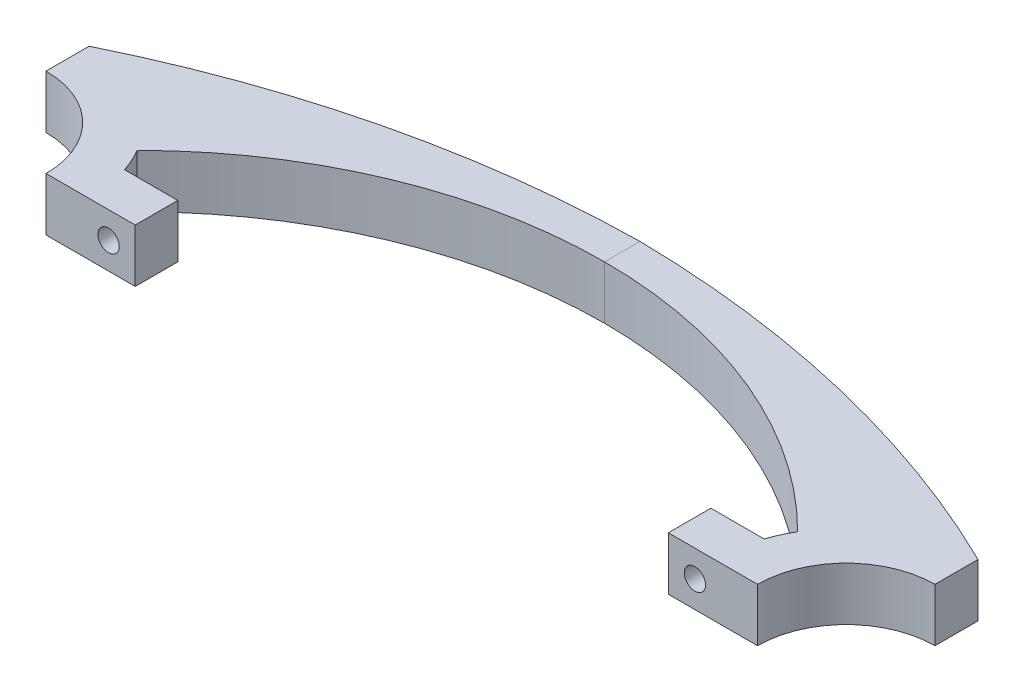
ISO-10303-21;
HEADER;
FILE_DESCRIPTION(('STEP AP214'),'2;1');
FILE_NAME('part.step','',(''),(''),'','','');
FILE_SCHEMA(('AUTOMOTIVE_DESIGN { 1 0 10303 214 1 1 1 1 }'));
ENDSEC;
DATA;
#1=APPLICATION_CONTEXT('core data for automotive mechanical design processes');
#2=APPLICATION_PROTOCOL_DEFINITION('international standard','automotive_design',2000,#1);
#3=PRODUCT_CONTEXT('',#1,'mechanical');
#4=PRODUCT('Part','Part','',(#3));
#5=PRODUCT_RELATED_PRODUCT_CATEGORY('part','',(#4));
#6=PRODUCT_DEFINITION_FORMATION('','',#4);
#7=PRODUCT_DEFINITION_CONTEXT('part definition',#1,'design');
#8=PRODUCT_DEFINITION('design','',#6,#7);
#9=PRODUCT_DEFINITION_SHAPE('','',#8);
#10=(LENGTH_UNIT() NAMED_UNIT(*) SI_UNIT(.MILLI.,.METRE.));
#11=(NAMED_UNIT(*) PLANE_ANGLE_UNIT() SI_UNIT($,.RADIAN.));
#12=(NAMED_UNIT(*) SI_UNIT($,.STERADIAN.) SOLID_ANGLE_UNIT());
#13=UNCERTAINTY_MEASURE_WITH_UNIT(LENGTH_MEASURE(1.E-05),#10,'distance_accuracy_value','');
#14=(GEOMETRIC_REPRESENTATION_CONTEXT(3) GLOBAL_UNCERTAINTY_ASSIGNED_CONTEXT((#13)) GLOBAL_UNIT_ASSIGNED_CONTEXT((#10,
#11,#12)) REPRESENTATION_CONTEXT('',''));
#15=CARTESIAN_POINT('',(0.,0.,0.));
#16=DIRECTION('',(0.,0.,1.));
#17=DIRECTION('',(1.,0.,0.));
#18=AXIS2_PLACEMENT_3D('',#15,#16,#17);
#19=CARTESIAN_POINT('',(31.2389251159793,17.8221667419848,54.0159850443195));
#20=DIRECTION('',(0.,-1.,0.));
#21=DIRECTION('',(0.,0.,1.));
#22=AXIS2_PLACEMENT_3D('',#19,#20,#21);
#23=PLANE('',#22);
#24=CARTESIAN_POINT('',(31.1865919957993,17.8221667419848,91.246780523602));
#25=DIRECTION('',(0.,-1.,0.));
#26=DIRECTION('',(0.,0.,1.));
#27=AXIS2_PLACEMENT_3D('',#24,#25,#26);
#28=CIRCLE('',#27,65.8035553224474);
#29=CARTESIAN_POINT('',(77.7660246317547,17.8221667419848,44.7659850443195));
#30=VERTEX_POINT('',#29);
#31=CARTESIAN_POINT('',(31.2389251159793,17.8221667419848,25.4432460112452));
#32=VERTEX_POINT('',#31);
#33=EDGE_CURVE('P0_E98',#30,#32,#28,.F.);
#34=ORIENTED_EDGE('',*,*,#33,.T.);
#35=DIRECTION('',(0.,0.,-1.));
#36=VECTOR('',#35,1.);
#37=CARTESIAN_POINT('',(31.2389251159793,17.8221667419848,54.0159850443195));
#38=LINE('',#37,#36);
#39=CARTESIAN_POINT('',(31.2389251159793,17.8221667419848,20.4533621410306));
#40=VERTEX_POINT('',#39);
#41=EDGE_CURVE('P0_E87',#32,#40,#38,.T.);
#42=ORIENTED_EDGE('',*,*,#41,.T.);
#43=CARTESIAN_POINT('',(29.2611846844426,17.8221667419848,166.971743858237));
#44=DIRECTION('',(0.,-1.,0.));
#45=DIRECTION('',(0.,0.,1.));
#46=AXIS2_PLACEMENT_3D('',#43,#44,#45);
#47=CIRCLE('',#46,146.53172911777);
#48=CARTESIAN_POINT('',(93.8639251159793,17.8221667419848,35.4497549477167));
#49=VERTEX_POINT('',#48);
#50=EDGE_CURVE('P0_E96',#49,#40,#47,.F.);
#51=ORIENTED_EDGE('',*,*,#50,.F.);
#52=DIRECTION('',(0.,0.,-1.));
#53=VECTOR('',#52,1.);
#54=CARTESIAN_POINT('',(93.8639251159793,17.8221667419848,54.0159850443195));
#55=LINE('',#54,#53);
#56=CARTESIAN_POINT('',(93.8639251159793,17.8221667419848,41.5159850443195));
#57=VERTEX_POINT('',#56);
#58=EDGE_CURVE('P0_E133',#57,#49,#55,.T.);
#59=ORIENTED_EDGE('',*,*,#58,.F.);
#60=CARTESIAN_POINT('',(93.8639251159793,17.8221667419848,54.0159850443195));
#61=DIRECTION('',(0.,-1.,0.));
#62=DIRECTION('',(0.,0.,1.));
#63=AXIS2_PLACEMENT_3D('',#60,#61,#62);
#64=CIRCLE('',#63,12.5);
#65=CARTESIAN_POINT('',(81.3639251159793,17.8221667419848,54.0159850443195));
#66=VERTEX_POINT('',#65);
#67=EDGE_CURVE('P0_E121',#66,#57,#64,.T.);
#68=ORIENTED_EDGE('',*,*,#67,.F.);
#69=DIRECTION('',(-1.,0.,0.));
#70=VECTOR('',#69,1.);
#71=CARTESIAN_POINT('',(31.2389251159793,17.8221667419848,54.0159850443195));
#72=LINE('',#71,#70);
#73=CARTESIAN_POINT('',(68.7939251159793,17.8221667419848,54.0159850443195));
#74=VERTEX_POINT('',#73);
#75=EDGE_CURVE('P0_E124',#66,#74,#72,.T.);
#76=ORIENTED_EDGE('',*,*,#75,.T.);
#77=DIRECTION('',(0.,0.,-1.));
#78=VECTOR('',#77,1.);
#79=CARTESIAN_POINT('',(68.7939251159793,17.8221667419848,54.0159850443195));
#80=LINE('',#79,#78);
#81=CARTESIAN_POINT('',(68.7939251159793,17.8221667419848,48.0159850443195));
#82=VERTEX_POINT('',#81);
#83=EDGE_CURVE('P0_E127',#74,#82,#80,.T.);
#84=ORIENTED_EDGE('',*,*,#83,.T.);
#85=DIRECTION('',(1.,0.,0.));
#86=VECTOR('',#85,1.);
#87=CARTESIAN_POINT('',(31.2389251159793,17.8221667419848,48.0159850443195));
#88=LINE('',#87,#86);
#89=CARTESIAN_POINT('',(76.2939251159793,17.8221667419848,48.0159850443195));
#90=VERTEX_POINT('',#89);
#91=EDGE_CURVE('P0_E129',#82,#90,#88,.T.);
#92=ORIENTED_EDGE('',*,*,#91,.T.);
#93=CARTESIAN_POINT('',(93.8639251159793,17.8221667419848,54.0159850443195));
#94=DIRECTION('',(0.,-1.,0.));
#95=DIRECTION('',(0.,0.,1.));
#96=AXIS2_PLACEMENT_3D('',#93,#94,#95);
#97=CIRCLE('',#96,18.5662300966028);
#98=EDGE_CURVE('P0_E131',#90,#30,#97,.T.);
#99=ORIENTED_EDGE('',*,*,#98,.T.);
#100=EDGE_LOOP('',(#34,#42,#51,#59,#68,#76,#84,#92,#99));
#101=FACE_BOUND('',#100,.T.);
#102=ADVANCED_FACE('P0_F16',(#101),#23,.T.);
#103=CARTESIAN_POINT('',(31.2389251159793,25.3221667419848,54.0159850443195));
#104=DIRECTION('',(0.,-1.,0.));
#105=DIRECTION('',(0.,0.,1.));
#106=AXIS2_PLACEMENT_3D('',#103,#104,#105);
#107=PLANE('',#106);
#108=DIRECTION('',(0.,0.,-1.));
#109=VECTOR('',#108,1.);
#110=CARTESIAN_POINT('',(31.2389251159793,25.3221667419848,54.0159850443195));
#111=LINE('',#110,#109);
#112=CARTESIAN_POINT('',(31.2389251159793,25.3221667419848,25.4432460112452));
#113=VERTEX_POINT('',#112);
#114=CARTESIAN_POINT('',(31.2389251159793,25.3221667419848,20.4533621410306));
#115=VERTEX_POINT('',#114);
#116=EDGE_CURVE('P0_E30',#113,#115,#111,.T.);
#117=ORIENTED_EDGE('',*,*,#116,.F.);
#118=CARTESIAN_POINT('',(31.1865919957993,25.3221667419848,91.246780523602));
#119=DIRECTION('',(0.,-1.,0.));
#120=DIRECTION('',(0.,0.,1.));
#121=AXIS2_PLACEMENT_3D('',#118,#119,#120);
#122=CIRCLE('',#121,65.8035553224474);
#123=CARTESIAN_POINT('',(77.7660246317547,25.3221667419848,44.7659850443195));
#124=VERTEX_POINT('',#123);
#125=EDGE_CURVE('P0_E113',#113,#124,#122,.T.);
#126=ORIENTED_EDGE('',*,*,#125,.T.);
#127=CARTESIAN_POINT('',(93.8639251159793,25.3221667419848,54.0159850443195));
#128=DIRECTION('',(0.,-1.,0.));
#129=DIRECTION('',(0.,0.,1.));
#130=AXIS2_PLACEMENT_3D('',#127,#128,#129);
#131=CIRCLE('',#130,18.5662300966028);
#132=CARTESIAN_POINT('',(76.2939251159793,25.3221667419848,48.0159850443195));
#133=VERTEX_POINT('',#132);
#134=EDGE_CURVE('P0_E144',#133,#124,#131,.T.);
#135=ORIENTED_EDGE('',*,*,#134,.F.);
#136=DIRECTION('',(1.,0.,0.));
#137=VECTOR('',#136,1.);
#138=CARTESIAN_POINT('',(31.2389251159793,25.3221667419848,48.0159850443195));
#139=LINE('',#138,#137);
#140=CARTESIAN_POINT('',(68.7939251159793,25.3221667419848,48.0159850443195));
#141=VERTEX_POINT('',#140);
#142=EDGE_CURVE('P0_E142',#141,#133,#139,.T.);
#143=ORIENTED_EDGE('',*,*,#142,.F.);
#144=DIRECTION('',(0.,0.,-1.));
#145=VECTOR('',#144,1.);
#146=CARTESIAN_POINT('',(68.7939251159793,25.3221667419848,54.0159850443195));
#147=LINE('',#146,#145);
#148=CARTESIAN_POINT('',(68.7939251159793,25.3221667419848,54.0159850443195));
#149=VERTEX_POINT('',#148);
#150=EDGE_CURVE('P0_E140',#149,#141,#147,.T.);
#151=ORIENTED_EDGE('',*,*,#150,.F.);
#152=DIRECTION('',(-1.,0.,0.));
#153=VECTOR('',#152,1.);
#154=CARTESIAN_POINT('',(31.2389251159793,25.3221667419848,54.0159850443195));
#155=LINE('',#154,#153);
#156=CARTESIAN_POINT('',(81.3639251159793,25.3221667419848,54.0159850443195));
#157=VERTEX_POINT('',#156);
#158=EDGE_CURVE('P0_E138',#157,#149,#155,.T.);
#159=ORIENTED_EDGE('',*,*,#158,.F.);
#160=CARTESIAN_POINT('',(93.8639251159793,25.3221667419848,54.0159850443195));
#161=DIRECTION('',(0.,-1.,0.));
#162=DIRECTION('',(0.,0.,1.));
#163=AXIS2_PLACEMENT_3D('',#160,#161,#162);
#164=CIRCLE('',#163,12.5);
#165=CARTESIAN_POINT('',(93.8639251159793,25.3221667419848,41.5159850443195));
#166=VERTEX_POINT('',#165);
#167=EDGE_CURVE('P0_E117',#157,#166,#164,.T.);
#168=ORIENTED_EDGE('',*,*,#167,.T.);
#169=DIRECTION('',(0.,0.,-1.));
#170=VECTOR('',#169,1.);
#171=CARTESIAN_POINT('',(93.8639251159793,25.3221667419848,54.0159850443195));
#172=LINE('',#171,#170);
#173=CARTESIAN_POINT('',(93.8639251159793,25.3221667419848,35.4497549477167));
#174=VERTEX_POINT('',#173);
#175=EDGE_CURVE('P0_E125',#166,#174,#172,.T.);
#176=ORIENTED_EDGE('',*,*,#175,.T.);
#177=CARTESIAN_POINT('',(29.2611846844426,25.3221667419848,166.971743858237));
#178=DIRECTION('',(0.,-1.,0.));
#179=DIRECTION('',(0.,0.,1.));
#180=AXIS2_PLACEMENT_3D('',#177,#178,#179);
#181=CIRCLE('',#180,146.53172911777);
#182=EDGE_CURVE('P0_E109',#115,#174,#181,.T.);
#183=ORIENTED_EDGE('',*,*,#182,.F.);
#184=EDGE_LOOP('',(#117,#126,#135,#143,#151,#159,#168,#176,#183));
#185=FACE_BOUND('',#184,.T.);
#186=ADVANCED_FACE('P0_F168',(#185),#107,.F.);
#187=CARTESIAN_POINT('',(31.1865919957993,93.1146501011302,91.246780523602));
#188=DIRECTION('',(0.,-1.,0.));
#189=DIRECTION('',(0.,0.,1.));
#190=AXIS2_PLACEMENT_3D('',#187,#188,#189);
#191=CYLINDRICAL_SURFACE('',#190,65.8035553224474);
#192=ORIENTED_EDGE('',*,*,#125,.F.);
#193=DIRECTION('',(0.,-1.,0.));
#194=VECTOR('',#193,1.);
#195=CARTESIAN_POINT('',(31.2389251159793,93.1146501011302,25.4432460112452));
#196=LINE('',#195,#194);
#197=EDGE_CURVE('P0_E99',#113,#32,#196,.T.);
#198=ORIENTED_EDGE('',*,*,#197,.T.);
#199=ORIENTED_EDGE('',*,*,#33,.F.);
#200=DIRECTION('',(0.,-1.,0.));
#201=VECTOR('',#200,1.);
#202=CARTESIAN_POINT('',(77.7660246317547,93.1146501011302,44.7659850443195));
#203=LINE('',#202,#201);
#204=EDGE_CURVE('P0_E38',#124,#30,#203,.T.);
#205=ORIENTED_EDGE('',*,*,#204,.F.);
#206=EDGE_LOOP('',(#192,#198,#199,#205));
#207=FACE_BOUND('',#206,.T.);
#208=ADVANCED_FACE('P0_F179',(#207),#191,.F.);
#209=CARTESIAN_POINT('',(29.2611846844426,93.1146501011302,166.971743858237));
#210=DIRECTION('',(0.,-1.,0.));
#211=DIRECTION('',(0.,0.,1.));
#212=AXIS2_PLACEMENT_3D('',#209,#210,#211);
#213=CYLINDRICAL_SURFACE('',#212,146.53172911777);
#214=DIRECTION('',(0.,-1.,0.));
#215=VECTOR('',#214,1.);
#216=CARTESIAN_POINT('',(31.2389251159793,93.1146501011302,20.4533621410306));
#217=LINE('',#216,#215);
#218=EDGE_CURVE('P0_E10',#115,#40,#217,.T.);
#219=ORIENTED_EDGE('',*,*,#218,.F.);
#220=ORIENTED_EDGE('',*,*,#182,.T.);
#221=DIRECTION('',(0.,1.,0.));
#222=VECTOR('',#221,1.);
#223=CARTESIAN_POINT('',(93.8639251159793,17.8221667419848,35.4497549477167));
#224=LINE('',#223,#222);
#225=EDGE_CURVE('P0_E104',#49,#174,#224,.T.);
#226=ORIENTED_EDGE('',*,*,#225,.F.);
#227=ORIENTED_EDGE('',*,*,#50,.T.);
#228=EDGE_LOOP('',(#219,#220,#226,#227));
#229=FACE_BOUND('',#228,.T.);
#230=ADVANCED_FACE('P0_F102',(#229),#213,.T.);
#231=CARTESIAN_POINT('',(93.8639251159793,17.8221667419848,54.0159850443195));
#232=DIRECTION('',(0.,1.,0.));
#233=DIRECTION('',(0.,0.,-1.));
#234=AXIS2_PLACEMENT_3D('',#231,#232,#233);
#235=CYLINDRICAL_SURFACE('',#234,12.5);
#236=ORIENTED_EDGE('',*,*,#167,.F.);
#237=DIRECTION('',(0.,1.,0.));
#238=VECTOR('',#237,1.);
#239=CARTESIAN_POINT('',(81.3639251159793,17.8221667419848,54.0159850443195));
#240=LINE('',#239,#238);
#241=EDGE_CURVE('P0_E24',#66,#157,#240,.T.);
#242=ORIENTED_EDGE('',*,*,#241,.F.);
#243=ORIENTED_EDGE('',*,*,#67,.T.);
#244=DIRECTION('',(0.,1.,0.));
#245=VECTOR('',#244,1.);
#246=CARTESIAN_POINT('',(93.8639251159793,17.8221667419848,41.5159850443195));
#247=LINE('',#246,#245);
#248=EDGE_CURVE('P0_E135',#57,#166,#247,.T.);
#249=ORIENTED_EDGE('',*,*,#248,.T.);
#250=EDGE_LOOP('',(#236,#242,#243,#249));
#251=FACE_BOUND('',#250,.T.);
#252=ADVANCED_FACE('P0_F18',(#251),#235,.F.);
#253=CARTESIAN_POINT('',(31.2389251159793,17.8221667419848,54.0159850443195));
#254=DIRECTION('',(0.,0.,-1.));
#255=DIRECTION('',(1.,0.,0.));
#256=AXIS2_PLACEMENT_3D('',#253,#254,#255);
#257=PLANE('',#256);
#258=CARTESIAN_POINT('',(72.5439251159793,21.5721667419848,54.0159850443195));
#259=DIRECTION('',(0.,0.,-1.));
#260=DIRECTION('',(1.,0.,0.));
#261=AXIS2_PLACEMENT_3D('',#258,#259,#260);
#262=CIRCLE('',#261,1.5);
#263=CARTESIAN_POINT('',(74.0439251159793,21.5721667419848,54.0159850443195));
#264=VERTEX_POINT('',#263);
#265=EDGE_CURVE('P0_E114',#264,#264,#262,.T.);
#266=ORIENTED_EDGE('',*,*,#265,.T.);
#267=EDGE_LOOP('',(#266));
#268=FACE_BOUND('',#267,.T.);
#269=ORIENTED_EDGE('',*,*,#158,.T.);
#270=DIRECTION('',(0.,1.,0.));
#271=VECTOR('',#270,1.);
#272=CARTESIAN_POINT('',(68.7939251159793,17.8221667419848,54.0159850443195));
#273=LINE('',#272,#271);
#274=EDGE_CURVE('P0_E156',#74,#149,#273,.T.);
#275=ORIENTED_EDGE('',*,*,#274,.F.);
#276=ORIENTED_EDGE('',*,*,#75,.F.);
#277=ORIENTED_EDGE('',*,*,#241,.T.);
#278=EDGE_LOOP('',(#269,#275,#276,#277));
#279=FACE_BOUND('',#278,.T.);
#280=ADVANCED_FACE('P0_F161',(#268,#279),#257,.F.);
#281=CARTESIAN_POINT('',(68.7939251159793,17.8221667419848,54.0159850443195));
#282=DIRECTION('',(1.,0.,0.));
#283=DIRECTION('',(0.,0.,1.));
#284=AXIS2_PLACEMENT_3D('',#281,#282,#283);
#285=PLANE('',#284);
#286=ORIENTED_EDGE('',*,*,#150,.T.);
#287=DIRECTION('',(0.,1.,0.));
#288=VECTOR('',#287,1.);
#289=CARTESIAN_POINT('',(68.7939251159793,17.8221667419848,48.0159850443195));
#290=LINE('',#289,#288);
#291=EDGE_CURVE('P0_E153',#82,#141,#290,.T.);
#292=ORIENTED_EDGE('',*,*,#291,.F.);
#293=ORIENTED_EDGE('',*,*,#83,.F.);
#294=ORIENTED_EDGE('',*,*,#274,.T.);
#295=EDGE_LOOP('',(#286,#292,#293,#294));
#296=FACE_BOUND('',#295,.T.);
#297=ADVANCED_FACE('P0_F204',(#296),#285,.F.);
#298=CARTESIAN_POINT('',(31.2389251159793,17.8221667419848,48.0159850443195));
#299=DIRECTION('',(0.,0.,1.));
#300=DIRECTION('',(-1.,0.,0.));
#301=AXIS2_PLACEMENT_3D('',#298,#299,#300);
#302=PLANE('',#301);
#303=CARTESIAN_POINT('',(72.5439251159793,21.5721667419848,48.0159850443195));
#304=DIRECTION('',(0.,0.,-1.));
#305=DIRECTION('',(1.,0.,0.));
#306=AXIS2_PLACEMENT_3D('',#303,#304,#305);
#307=CIRCLE('',#306,1.5);
#308=CARTESIAN_POINT('',(74.0439251159793,21.5721667419848,48.0159850443195));
#309=VERTEX_POINT('',#308);
#310=EDGE_CURVE('P0_E118',#309,#309,#307,.T.);
#311=ORIENTED_EDGE('',*,*,#310,.F.);
#312=EDGE_LOOP('',(#311));
#313=FACE_BOUND('',#312,.T.);
#314=ORIENTED_EDGE('',*,*,#142,.T.);
#315=DIRECTION('',(0.,1.,0.));
#316=VECTOR('',#315,1.);
#317=CARTESIAN_POINT('',(76.2939251159793,17.8221667419848,48.0159850443195));
#318=LINE('',#317,#316);
#319=EDGE_CURVE('P0_E150',#90,#133,#318,.T.);
#320=ORIENTED_EDGE('',*,*,#319,.F.);
#321=ORIENTED_EDGE('',*,*,#91,.F.);
#322=ORIENTED_EDGE('',*,*,#291,.T.);
#323=EDGE_LOOP('',(#314,#320,#321,#322));
#324=FACE_BOUND('',#323,.T.);
#325=ADVANCED_FACE('P0_F201',(#313,#324),#302,.F.);
#326=CARTESIAN_POINT('',(93.8639251159793,17.8221667419848,54.0159850443195));
#327=DIRECTION('',(0.,1.,0.));
#328=DIRECTION('',(0.,0.,-1.));
#329=AXIS2_PLACEMENT_3D('',#326,#327,#328);
#330=CYLINDRICAL_SURFACE('',#329,18.5662300966028);
#331=ORIENTED_EDGE('',*,*,#134,.T.);
#332=ORIENTED_EDGE('',*,*,#204,.T.);
#333=ORIENTED_EDGE('',*,*,#98,.F.);
#334=ORIENTED_EDGE('',*,*,#319,.T.);
#335=EDGE_LOOP('',(#331,#332,#333,#334));
#336=FACE_BOUND('',#335,.T.);
#337=ADVANCED_FACE('P0_F177',(#336),#330,.T.);
#338=CARTESIAN_POINT('',(93.8639251159793,17.8221667419848,54.0159850443195));
#339=DIRECTION('',(1.,0.,0.));
#340=DIRECTION('',(0.,0.,1.));
#341=AXIS2_PLACEMENT_3D('',#338,#339,#340);
#342=PLANE('',#341);
#343=ORIENTED_EDGE('',*,*,#175,.F.);
#344=ORIENTED_EDGE('',*,*,#248,.F.);
#345=ORIENTED_EDGE('',*,*,#58,.T.);
#346=ORIENTED_EDGE('',*,*,#225,.T.);
#347=EDGE_LOOP('',(#343,#344,#345,#346));
#348=FACE_BOUND('',#347,.T.);
#349=ADVANCED_FACE('P0_F172',(#348),#342,.T.);
#350=CARTESIAN_POINT('',(72.5439251159793,21.5721667419848,54.0159850443195));
#351=DIRECTION('',(0.,0.,-1.));
#352=DIRECTION('',(1.,0.,0.));
#353=AXIS2_PLACEMENT_3D('',#350,#351,#352);
#354=CYLINDRICAL_SURFACE('',#353,1.5);
#355=ORIENTED_EDGE('',*,*,#265,.F.);
#356=EDGE_LOOP('',(#355));
#357=FACE_BOUND('',#356,.T.);
#358=ORIENTED_EDGE('',*,*,#310,.T.);
#359=EDGE_LOOP('',(#358));
#360=FACE_BOUND('',#359,.T.);
#361=ADVANCED_FACE('P0_F195',(#357,#360),#354,.F.);
#362=CARTESIAN_POINT('',(31.2389251159793,25.3221667419848,54.0159850443195));
#363=DIRECTION('',(-1.,0.,0.));
#364=DIRECTION('',(0.,0.,-1.));
#365=AXIS2_PLACEMENT_3D('',#362,#363,#364);
#366=PLANE('',#365);
#367=ORIENTED_EDGE('',*,*,#116,.T.);
#368=ORIENTED_EDGE('',*,*,#218,.T.);
#369=ORIENTED_EDGE('',*,*,#41,.F.);
#370=ORIENTED_EDGE('',*,*,#197,.F.);
#371=EDGE_LOOP('',(#367,#368,#369,#370));
#372=FACE_BOUND('',#371,.T.);
#373=ADVANCED_FACE('P0_F86',(#372),#366,.T.);
#374=CLOSED_SHELL('',(#102,#186,#208,#230,#252,#280,#297,#325,#337,#349,#361,#373));
#375=MANIFOLD_SOLID_BREP('P0_B1',#374);
#376=CARTESIAN_POINT('',(31.2389251159793,25.3221667419848,54.0159850443195));
#377=DIRECTION('',(0.,1.,0.));
#378=DIRECTION('',(0.,0.,1.));
#379=AXIS2_PLACEMENT_3D('',#376,#377,#378);
#380=PLANE('',#379);
#381=CARTESIAN_POINT('',(31.2912582361593,25.3221667419848,91.246780523602));
#382=DIRECTION('',(0.,1.,0.));
#383=DIRECTION('',(0.,0.,1.));
#384=AXIS2_PLACEMENT_3D('',#381,#382,#383);
#385=CIRCLE('',#384,65.8035553224474);
#386=CARTESIAN_POINT('',(-15.288174399796,25.3221667419848,44.7659850443195));
#387=VERTEX_POINT('',#386);
#388=CARTESIAN_POINT('',(31.2389251159793,25.3221667419848,25.4432460112452));
#389=VERTEX_POINT('',#388);
#390=EDGE_CURVE('P1_E99',#387,#389,#385,.F.);
#391=ORIENTED_EDGE('',*,*,#390,.T.);
#392=DIRECTION('',(0.,0.,-1.));
#393=VECTOR('',#392,1.);
#394=CARTESIAN_POINT('',(31.2389251159793,25.3221667419848,54.0159850443195));
#395=LINE('',#394,#393);
#396=CARTESIAN_POINT('',(31.2389251159793,25.3221667419848,20.4533621410306));
#397=VERTEX_POINT('',#396);
#398=EDGE_CURVE('P1_E88',#389,#397,#395,.T.);
#399=ORIENTED_EDGE('',*,*,#398,.T.);
#400=CARTESIAN_POINT('',(33.216665547516,25.3221667419848,166.971743858237));
#401=DIRECTION('',(0.,1.,0.));
#402=DIRECTION('',(0.,0.,1.));
#403=AXIS2_PLACEMENT_3D('',#400,#401,#402);
#404=CIRCLE('',#403,146.53172911777);
#405=CARTESIAN_POINT('',(-31.3860748840207,25.3221667419848,35.4497549477167));
#406=VERTEX_POINT('',#405);
#407=EDGE_CURVE('P1_E97',#406,#397,#404,.F.);
#408=ORIENTED_EDGE('',*,*,#407,.F.);
#409=DIRECTION('',(0.,0.,-1.));
#410=VECTOR('',#409,1.);
#411=CARTESIAN_POINT('',(-31.3860748840207,25.3221667419848,54.0159850443195));
#412=LINE('',#411,#410);
#413=CARTESIAN_POINT('',(-31.3860748840207,25.3221667419848,41.5159850443195));
#414=VERTEX_POINT('',#413);
#415=EDGE_CURVE('P1_E134',#414,#406,#412,.T.);
#416=ORIENTED_EDGE('',*,*,#415,.F.);
#417=CARTESIAN_POINT('',(-31.3860748840207,25.3221667419848,54.0159850443195));
#418=DIRECTION('',(0.,1.,0.));
#419=DIRECTION('',(0.,0.,1.));
#420=AXIS2_PLACEMENT_3D('',#417,#418,#419);
#421=CIRCLE('',#420,12.5);
#422=CARTESIAN_POINT('',(-18.8860748840207,25.3221667419848,54.0159850443195));
#423=VERTEX_POINT('',#422);
#424=EDGE_CURVE('P1_E122',#423,#414,#421,.T.);
#425=ORIENTED_EDGE('',*,*,#424,.F.);
#426=DIRECTION('',(1.,0.,0.));
#427=VECTOR('',#426,1.);
#428=CARTESIAN_POINT('',(31.2389251159793,25.3221667419848,54.0159850443195));
#429=LINE('',#428,#427);
#430=CARTESIAN_POINT('',(-6.31607488402069,25.3221667419848,54.0159850443195));
#431=VERTEX_POINT('',#430);
#432=EDGE_CURVE('P1_E125',#423,#431,#429,.T.);
#433=ORIENTED_EDGE('',*,*,#432,.T.);
#434=DIRECTION('',(0.,0.,-1.));
#435=VECTOR('',#434,1.);
#436=CARTESIAN_POINT('',(-6.31607488402069,25.3221667419848,54.0159850443195));
#437=LINE('',#436,#435);
#438=CARTESIAN_POINT('',(-6.31607488402069,25.3221667419848,48.0159850443195));
#439=VERTEX_POINT('',#438);
#440=EDGE_CURVE('P1_E128',#431,#439,#437,.T.);
#441=ORIENTED_EDGE('',*,*,#440,.T.);
#442=DIRECTION('',(-1.,0.,0.));
#443=VECTOR('',#442,1.);
#444=CARTESIAN_POINT('',(31.2389251159793,25.3221667419848,48.0159850443195));
#445=LINE('',#444,#443);
#446=CARTESIAN_POINT('',(-13.8160748840207,25.3221667419848,48.0159850443195));
#447=VERTEX_POINT('',#446);
#448=EDGE_CURVE('P1_E130',#439,#447,#445,.T.);
#449=ORIENTED_EDGE('',*,*,#448,.T.);
#450=CARTESIAN_POINT('',(-31.3860748840207,25.3221667419848,54.0159850443195));
#451=DIRECTION('',(0.,1.,0.));
#452=DIRECTION('',(0.,0.,1.));
#453=AXIS2_PLACEMENT_3D('',#450,#451,#452);
#454=CIRCLE('',#453,18.5662300966028);
#455=EDGE_CURVE('P1_E132',#447,#387,#454,.T.);
#456=ORIENTED_EDGE('',*,*,#455,.T.);
#457=EDGE_LOOP('',(#391,#399,#408,#416,#425,#433,#441,#449,#456));
#458=FACE_BOUND('',#457,.T.);
#459=ADVANCED_FACE('P1_F17',(#458),#380,.T.);
#460=CARTESIAN_POINT('',(31.2389251159793,17.8221667419848,54.0159850443195));
#461=DIRECTION('',(0.,1.,0.));
#462=DIRECTION('',(0.,0.,1.));
#463=AXIS2_PLACEMENT_3D('',#460,#461,#462);
#464=PLANE('',#463);
#465=DIRECTION('',(0.,0.,-1.));
#466=VECTOR('',#465,1.);
#467=CARTESIAN_POINT('',(31.2389251159793,17.8221667419848,54.0159850443195));
#468=LINE('',#467,#466);
#469=CARTESIAN_POINT('',(31.2389251159793,17.8221667419848,25.4432460112452));
#470=VERTEX_POINT('',#469);
#471=CARTESIAN_POINT('',(31.2389251159793,17.8221667419848,20.4533621410306));
#472=VERTEX_POINT('',#471);
#473=EDGE_CURVE('P1_E31',#470,#472,#468,.T.);
#474=ORIENTED_EDGE('',*,*,#473,.F.);
#475=CARTESIAN_POINT('',(31.2912582361593,17.8221667419848,91.246780523602));
#476=DIRECTION('',(0.,1.,0.));
#477=DIRECTION('',(0.,0.,1.));
#478=AXIS2_PLACEMENT_3D('',#475,#476,#477);
#479=CIRCLE('',#478,65.8035553224474);
#480=CARTESIAN_POINT('',(-15.288174399796,17.8221667419848,44.7659850443195));
#481=VERTEX_POINT('',#480);
#482=EDGE_CURVE('P1_E114',#470,#481,#479,.T.);
#483=ORIENTED_EDGE('',*,*,#482,.T.);
#484=CARTESIAN_POINT('',(-31.3860748840207,17.8221667419848,54.0159850443195));
#485=DIRECTION('',(0.,1.,0.));
#486=DIRECTION('',(0.,0.,1.));
#487=AXIS2_PLACEMENT_3D('',#484,#485,#486);
#488=CIRCLE('',#487,18.5662300966028);
#489=CARTESIAN_POINT('',(-13.8160748840207,17.8221667419848,48.0159850443195));
#490=VERTEX_POINT('',#489);
#491=EDGE_CURVE('P1_E145',#490,#481,#488,.T.);
#492=ORIENTED_EDGE('',*,*,#491,.F.);
#493=DIRECTION('',(-1.,0.,0.));
#494=VECTOR('',#493,1.);
#495=CARTESIAN_POINT('',(31.2389251159793,17.8221667419848,48.0159850443195));
#496=LINE('',#495,#494);
#497=CARTESIAN_POINT('',(-6.31607488402069,17.8221667419848,48.0159850443195));
#498=VERTEX_POINT('',#497);
#499=EDGE_CURVE('P1_E143',#498,#490,#496,.T.);
#500=ORIENTED_EDGE('',*,*,#499,.F.);
#501=DIRECTION('',(0.,0.,-1.));
#502=VECTOR('',#501,1.);
#503=CARTESIAN_POINT('',(-6.31607488402069,17.8221667419848,54.0159850443195));
#504=LINE('',#503,#502);
#505=CARTESIAN_POINT('',(-6.31607488402069,17.8221667419848,54.0159850443195));
#506=VERTEX_POINT('',#505);
#507=EDGE_CURVE('P1_E141',#506,#498,#504,.T.);
#508=ORIENTED_EDGE('',*,*,#507,.F.);
#509=DIRECTION('',(1.,0.,0.));
#510=VECTOR('',#509,1.);
#511=CARTESIAN_POINT('',(31.2389251159793,17.8221667419848,54.0159850443195));
#512=LINE('',#511,#510);
#513=CARTESIAN_POINT('',(-18.8860748840207,17.8221667419848,54.0159850443195));
#514=VERTEX_POINT('',#513);
#515=EDGE_CURVE('P1_E139',#514,#506,#512,.T.);
#516=ORIENTED_EDGE('',*,*,#515,.F.);
#517=CARTESIAN_POINT('',(-31.3860748840207,17.8221667419848,54.0159850443195));
#518=DIRECTION('',(0.,1.,0.));
#519=DIRECTION('',(0.,0.,1.));
#520=AXIS2_PLACEMENT_3D('',#517,#518,#519);
#521=CIRCLE('',#520,12.5);
#522=CARTESIAN_POINT('',(-31.3860748840207,17.8221667419848,41.5159850443195));
#523=VERTEX_POINT('',#522);
#524=EDGE_CURVE('P1_E118',#514,#523,#521,.T.);
#525=ORIENTED_EDGE('',*,*,#524,.T.);
#526=DIRECTION('',(0.,0.,-1.));
#527=VECTOR('',#526,1.);
#528=CARTESIAN_POINT('',(-31.3860748840207,17.8221667419848,54.0159850443195));
#529=LINE('',#528,#527);
#530=CARTESIAN_POINT('',(-31.3860748840207,17.8221667419848,35.4497549477167));
#531=VERTEX_POINT('',#530);
#532=EDGE_CURVE('P1_E126',#523,#531,#529,.T.);
#533=ORIENTED_EDGE('',*,*,#532,.T.);
#534=CARTESIAN_POINT('',(33.216665547516,17.8221667419848,166.971743858237));
#535=DIRECTION('',(0.,1.,0.));
#536=DIRECTION('',(0.,0.,1.));
#537=AXIS2_PLACEMENT_3D('',#534,#535,#536);
#538=CIRCLE('',#537,146.53172911777);
#539=EDGE_CURVE('P1_E110',#472,#531,#538,.T.);
#540=ORIENTED_EDGE('',*,*,#539,.F.);
#541=EDGE_LOOP('',(#474,#483,#492,#500,#508,#516,#525,#533,#540));
#542=FACE_BOUND('',#541,.T.);
#543=ADVANCED_FACE('P1_F169',(#542),#464,.F.);
#544=CARTESIAN_POINT('',(31.2912582361593,-49.9703166171606,91.246780523602));
#545=DIRECTION('',(0.,1.,0.));
#546=DIRECTION('',(0.,0.,1.));
#547=AXIS2_PLACEMENT_3D('',#544,#545,#546);
#548=CYLINDRICAL_SURFACE('',#547,65.8035553224474);
#549=ORIENTED_EDGE('',*,*,#482,.F.);
#550=DIRECTION('',(0.,1.,0.));
#551=VECTOR('',#550,1.);
#552=CARTESIAN_POINT('',(31.2389251159793,-49.9703166171606,25.4432460112452));
#553=LINE('',#552,#551);
#554=EDGE_CURVE('P1_E100',#470,#389,#553,.T.);
#555=ORIENTED_EDGE('',*,*,#554,.T.);
#556=ORIENTED_EDGE('',*,*,#390,.F.);
#557=DIRECTION('',(0.,1.,0.));
#558=VECTOR('',#557,1.);
#559=CARTESIAN_POINT('',(-15.288174399796,-49.9703166171606,44.7659850443195));
#560=LINE('',#559,#558);
#561=EDGE_CURVE('P1_E39',#481,#387,#560,.T.);
#562=ORIENTED_EDGE('',*,*,#561,.F.);
#563=EDGE_LOOP('',(#549,#555,#556,#562));
#564=FACE_BOUND('',#563,.T.);
#565=ADVANCED_FACE('P1_F180',(#564),#548,.F.);
#566=CARTESIAN_POINT('',(33.216665547516,-49.9703166171606,166.971743858237));
#567=DIRECTION('',(0.,1.,0.));
#568=DIRECTION('',(0.,0.,1.));
#569=AXIS2_PLACEMENT_3D('',#566,#567,#568);
#570=CYLINDRICAL_SURFACE('',#569,146.53172911777);
#571=DIRECTION('',(0.,1.,0.));
#572=VECTOR('',#571,1.);
#573=CARTESIAN_POINT('',(31.2389251159793,-49.9703166171606,20.4533621410306));
#574=LINE('',#573,#572);
#575=EDGE_CURVE('P1_E11',#472,#397,#574,.T.);
#576=ORIENTED_EDGE('',*,*,#575,.F.);
#577=ORIENTED_EDGE('',*,*,#539,.T.);
#578=DIRECTION('',(0.,-1.,0.));
#579=VECTOR('',#578,1.);
#580=CARTESIAN_POINT('',(-31.3860748840207,25.3221667419848,35.4497549477167));
#581=LINE('',#580,#579);
#582=EDGE_CURVE('P1_E105',#406,#531,#581,.T.);
#583=ORIENTED_EDGE('',*,*,#582,.F.);
#584=ORIENTED_EDGE('',*,*,#407,.T.);
#585=EDGE_LOOP('',(#576,#577,#583,#584));
#586=FACE_BOUND('',#585,.T.);
#587=ADVANCED_FACE('P1_F103',(#586),#570,.T.);
#588=CARTESIAN_POINT('',(-31.3860748840207,25.3221667419848,54.0159850443195));
#589=DIRECTION('',(0.,-1.,0.));
#590=DIRECTION('',(0.,0.,-1.));
#591=AXIS2_PLACEMENT_3D('',#588,#589,#590);
#592=CYLINDRICAL_SURFACE('',#591,12.5);
#593=ORIENTED_EDGE('',*,*,#524,.F.);
#594=DIRECTION('',(0.,-1.,0.));
#595=VECTOR('',#594,1.);
#596=CARTESIAN_POINT('',(-18.8860748840207,25.3221667419848,54.0159850443195));
#597=LINE('',#596,#595);
#598=EDGE_CURVE('P1_E25',#423,#514,#597,.T.);
#599=ORIENTED_EDGE('',*,*,#598,.F.);
#600=ORIENTED_EDGE('',*,*,#424,.T.);
#601=DIRECTION('',(0.,-1.,0.));
#602=VECTOR('',#601,1.);
#603=CARTESIAN_POINT('',(-31.3860748840207,25.3221667419848,41.5159850443195));
#604=LINE('',#603,#602);
#605=EDGE_CURVE('P1_E136',#414,#523,#604,.T.);
#606=ORIENTED_EDGE('',*,*,#605,.T.);
#607=EDGE_LOOP('',(#593,#599,#600,#606));
#608=FACE_BOUND('',#607,.T.);
#609=ADVANCED_FACE('P1_F19',(#608),#592,.F.);
#610=CARTESIAN_POINT('',(31.2389251159793,25.3221667419848,54.0159850443195));
#611=DIRECTION('',(0.,0.,-1.));
#612=DIRECTION('',(-1.,0.,0.));
#613=AXIS2_PLACEMENT_3D('',#610,#611,#612);
#614=PLANE('',#613);
#615=CARTESIAN_POINT('',(-10.0660748840207,21.5721667419848,54.0159850443195));
#616=DIRECTION('',(0.,0.,-1.));
#617=DIRECTION('',(-1.,0.,0.));
#618=AXIS2_PLACEMENT_3D('',#615,#616,#617);
#619=CIRCLE('',#618,1.5);
#620=CARTESIAN_POINT('',(-11.5660748840207,21.5721667419848,54.0159850443195));
#621=VERTEX_POINT('',#620);
#622=EDGE_CURVE('P1_E115',#621,#621,#619,.T.);
#623=ORIENTED_EDGE('',*,*,#622,.T.);
#624=EDGE_LOOP('',(#623));
#625=FACE_BOUND('',#624,.T.);
#626=ORIENTED_EDGE('',*,*,#515,.T.);
#627=DIRECTION('',(0.,-1.,0.));
#628=VECTOR('',#627,1.);
#629=CARTESIAN_POINT('',(-6.31607488402069,25.3221667419848,54.0159850443195));
#630=LINE('',#629,#628);
#631=EDGE_CURVE('P1_E157',#431,#506,#630,.T.);
#632=ORIENTED_EDGE('',*,*,#631,.F.);
#633=ORIENTED_EDGE('',*,*,#432,.F.);
#634=ORIENTED_EDGE('',*,*,#598,.T.);
#635=EDGE_LOOP('',(#626,#632,#633,#634));
#636=FACE_BOUND('',#635,.T.);
#637=ADVANCED_FACE('P1_F162',(#625,#636),#614,.F.);
#638=CARTESIAN_POINT('',(-6.31607488402069,25.3221667419848,54.0159850443195));
#639=DIRECTION('',(-1.,0.,0.));
#640=DIRECTION('',(0.,0.,1.));
#641=AXIS2_PLACEMENT_3D('',#638,#639,#640);
#642=PLANE('',#641);
#643=ORIENTED_EDGE('',*,*,#507,.T.);
#644=DIRECTION('',(0.,-1.,0.));
#645=VECTOR('',#644,1.);
#646=CARTESIAN_POINT('',(-6.31607488402069,25.3221667419848,48.0159850443195));
#647=LINE('',#646,#645);
#648=EDGE_CURVE('P1_E154',#439,#498,#647,.T.);
#649=ORIENTED_EDGE('',*,*,#648,.F.);
#650=ORIENTED_EDGE('',*,*,#440,.F.);
#651=ORIENTED_EDGE('',*,*,#631,.T.);
#652=EDGE_LOOP('',(#643,#649,#650,#651));
#653=FACE_BOUND('',#652,.T.);
#654=ADVANCED_FACE('P1_F205',(#653),#642,.F.);
#655=CARTESIAN_POINT('',(31.2389251159793,25.3221667419848,48.0159850443195));
#656=DIRECTION('',(0.,0.,1.));
#657=DIRECTION('',(1.,0.,0.));
#658=AXIS2_PLACEMENT_3D('',#655,#656,#657);
#659=PLANE('',#658);
#660=CARTESIAN_POINT('',(-10.0660748840207,21.5721667419848,48.0159850443195));
#661=DIRECTION('',(0.,0.,-1.));
#662=DIRECTION('',(-1.,0.,0.));
#663=AXIS2_PLACEMENT_3D('',#660,#661,#662);
#664=CIRCLE('',#663,1.5);
#665=CARTESIAN_POINT('',(-11.5660748840207,21.5721667419848,48.0159850443195));
#666=VERTEX_POINT('',#665);
#667=EDGE_CURVE('P1_E119',#666,#666,#664,.T.);
#668=ORIENTED_EDGE('',*,*,#667,.F.);
#669=EDGE_LOOP('',(#668));
#670=FACE_BOUND('',#669,.T.);
#671=ORIENTED_EDGE('',*,*,#499,.T.);
#672=DIRECTION('',(0.,-1.,0.));
#673=VECTOR('',#672,1.);
#674=CARTESIAN_POINT('',(-13.8160748840207,25.3221667419848,48.0159850443195));
#675=LINE('',#674,#673);
#676=EDGE_CURVE('P1_E151',#447,#490,#675,.T.);
#677=ORIENTED_EDGE('',*,*,#676,.F.);
#678=ORIENTED_EDGE('',*,*,#448,.F.);
#679=ORIENTED_EDGE('',*,*,#648,.T.);
#680=EDGE_LOOP('',(#671,#677,#678,#679));
#681=FACE_BOUND('',#680,.T.);
#682=ADVANCED_FACE('P1_F202',(#670,#681),#659,.F.);
#683=CARTESIAN_POINT('',(-31.3860748840207,25.3221667419848,54.0159850443195));
#684=DIRECTION('',(0.,-1.,0.));
#685=DIRECTION('',(0.,0.,-1.));
#686=AXIS2_PLACEMENT_3D('',#683,#684,#685);
#687=CYLINDRICAL_SURFACE('',#686,18.5662300966028);
#688=ORIENTED_EDGE('',*,*,#491,.T.);
#689=ORIENTED_EDGE('',*,*,#561,.T.);
#690=ORIENTED_EDGE('',*,*,#455,.F.);
#691=ORIENTED_EDGE('',*,*,#676,.T.);
#692=EDGE_LOOP('',(#688,#689,#690,#691));
#693=FACE_BOUND('',#692,.T.);
#694=ADVANCED_FACE('P1_F178',(#693),#687,.T.);
#695=CARTESIAN_POINT('',(-31.3860748840207,25.3221667419848,54.0159850443195));
#696=DIRECTION('',(-1.,0.,0.));
#697=DIRECTION('',(0.,0.,1.));
#698=AXIS2_PLACEMENT_3D('',#695,#696,#697);
#699=PLANE('',#698);
#700=ORIENTED_EDGE('',*,*,#532,.F.);
#701=ORIENTED_EDGE('',*,*,#605,.F.);
#702=ORIENTED_EDGE('',*,*,#415,.T.);
#703=ORIENTED_EDGE('',*,*,#582,.T.);
#704=EDGE_LOOP('',(#700,#701,#702,#703));
#705=FACE_BOUND('',#704,.T.);
#706=ADVANCED_FACE('P1_F173',(#705),#699,.T.);
#707=CARTESIAN_POINT('',(-10.0660748840207,21.5721667419848,54.0159850443195));
#708=DIRECTION('',(0.,0.,-1.));
#709=DIRECTION('',(-1.,0.,0.));
#710=AXIS2_PLACEMENT_3D('',#707,#708,#709);
#711=CYLINDRICAL_SURFACE('',#710,1.5);
#712=ORIENTED_EDGE('',*,*,#622,.F.);
#713=EDGE_LOOP('',(#712));
#714=FACE_BOUND('',#713,.T.);
#715=ORIENTED_EDGE('',*,*,#667,.T.);
#716=EDGE_LOOP('',(#715));
#717=FACE_BOUND('',#716,.T.);
#718=ADVANCED_FACE('P1_F196',(#714,#717),#711,.F.);
#719=CARTESIAN_POINT('',(31.2389251159793,17.8221667419848,54.0159850443195));
#720=DIRECTION('',(1.,0.,0.));
#721=DIRECTION('',(0.,0.,-1.));
#722=AXIS2_PLACEMENT_3D('',#719,#720,#721);
#723=PLANE('',#722);
#724=ORIENTED_EDGE('',*,*,#473,.T.);
#725=ORIENTED_EDGE('',*,*,#575,.T.);
#726=ORIENTED_EDGE('',*,*,#398,.F.);
#727=ORIENTED_EDGE('',*,*,#554,.F.);
#728=EDGE_LOOP('',(#724,#725,#726,#727));
#729=FACE_BOUND('',#728,.T.);
#730=ADVANCED_FACE('P1_F87',(#729),#723,.T.);
#731=CLOSED_SHELL('',(#459,#543,#565,#587,#609,#637,#654,#682,#694,#706,#718,#730));
#732=MANIFOLD_SOLID_BREP('P1_B1',#731);
#733=ADVANCED_BREP_SHAPE_REPRESENTATION('',(#18,#375,#732),#14);
#734=SHAPE_DEFINITION_REPRESENTATION(#9,#733);
ENDSEC;
END-ISO-10303-21;
